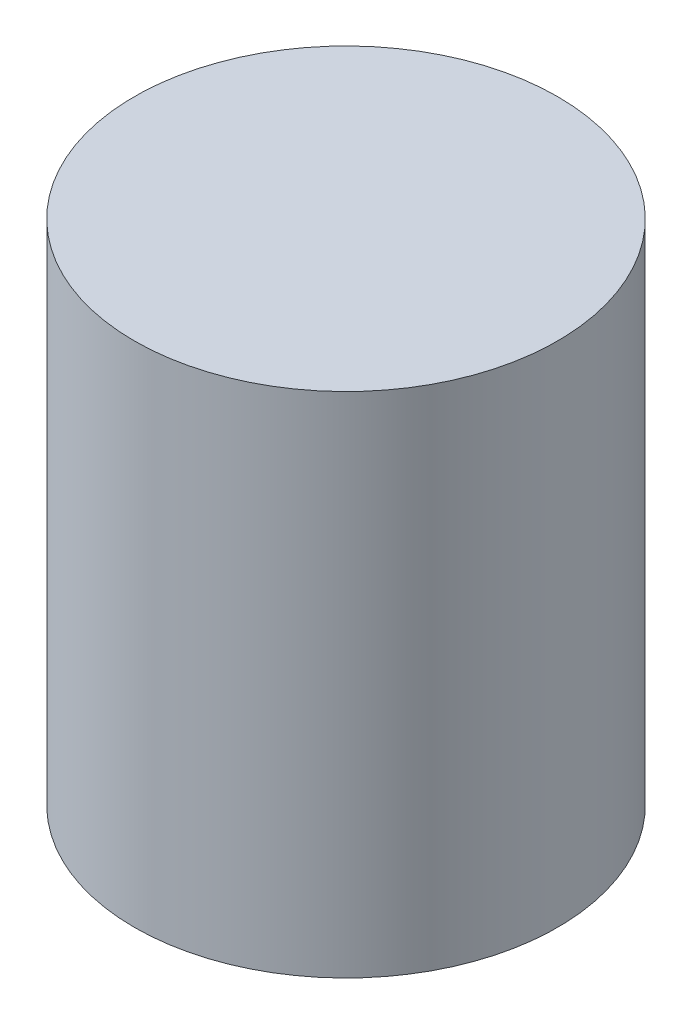
ISO-10303-21;
HEADER;
FILE_DESCRIPTION(('STEP AP214'),'2;1');
FILE_NAME('part.step','',(''),(''),'','','');
FILE_SCHEMA(('AUTOMOTIVE_DESIGN { 1 0 10303 214 1 1 1 1 }'));
ENDSEC;
DATA;
#1=APPLICATION_CONTEXT('core data for automotive mechanical design processes');
#2=APPLICATION_PROTOCOL_DEFINITION('international standard','automotive_design',2000,#1);
#3=PRODUCT_CONTEXT('',#1,'mechanical');
#4=PRODUCT('Part','Part','',(#3));
#5=PRODUCT_RELATED_PRODUCT_CATEGORY('part','',(#4));
#6=PRODUCT_DEFINITION_FORMATION('','',#4);
#7=PRODUCT_DEFINITION_CONTEXT('part definition',#1,'design');
#8=PRODUCT_DEFINITION('design','',#6,#7);
#9=PRODUCT_DEFINITION_SHAPE('','',#8);
#10=(LENGTH_UNIT() NAMED_UNIT(*) SI_UNIT(.MILLI.,.METRE.));
#11=(NAMED_UNIT(*) PLANE_ANGLE_UNIT() SI_UNIT($,.RADIAN.));
#12=(NAMED_UNIT(*) SI_UNIT($,.STERADIAN.) SOLID_ANGLE_UNIT());
#13=UNCERTAINTY_MEASURE_WITH_UNIT(LENGTH_MEASURE(1.E-05),#10,'distance_accuracy_value','');
#14=(GEOMETRIC_REPRESENTATION_CONTEXT(3) GLOBAL_UNCERTAINTY_ASSIGNED_CONTEXT((#13)) GLOBAL_UNIT_ASSIGNED_CONTEXT((#10,
#11,#12)) REPRESENTATION_CONTEXT('',''));
#15=CARTESIAN_POINT('',(0.,0.,0.));
#16=DIRECTION('',(0.,0.,1.));
#17=DIRECTION('',(1.,0.,0.));
#18=AXIS2_PLACEMENT_3D('',#15,#16,#17);
#19=CARTESIAN_POINT('',(0.,1.524,0.));
#20=DIRECTION('',(0.,-1.,0.));
#21=DIRECTION('',(0.,0.,-1.));
#22=AXIS2_PLACEMENT_3D('',#19,#20,#21);
#23=CYLINDRICAL_SURFACE('',#22,0.635);
#24=CARTESIAN_POINT('',(0.,1.524,0.));
#25=DIRECTION('',(0.,1.,0.));
#26=DIRECTION('',(0.,0.,1.));
#27=AXIS2_PLACEMENT_3D('',#24,#25,#26);
#28=CIRCLE('',#27,0.635);
#29=CARTESIAN_POINT('',(0.,1.524,0.635));
#30=VERTEX_POINT('',#29);
#31=EDGE_CURVE('E10',#30,#30,#28,.T.);
#32=ORIENTED_EDGE('',*,*,#31,.F.);
#33=EDGE_LOOP('',(#32));
#34=FACE_BOUND('',#33,.T.);
#35=CARTESIAN_POINT('',(0.,0.,0.));
#36=DIRECTION('',(0.,1.,0.));
#37=DIRECTION('',(0.,0.,1.));
#38=AXIS2_PLACEMENT_3D('',#35,#36,#37);
#39=CIRCLE('',#38,0.635);
#40=CARTESIAN_POINT('',(0.,0.,0.635));
#41=VERTEX_POINT('',#40);
#42=EDGE_CURVE('E34',#41,#41,#39,.T.);
#43=ORIENTED_EDGE('',*,*,#42,.T.);
#44=EDGE_LOOP('',(#43));
#45=FACE_BOUND('',#44,.T.);
#46=ADVANCED_FACE('F31',(#34,#45),#23,.T.);
#47=CARTESIAN_POINT('',(0.,1.524,0.));
#48=DIRECTION('',(0.,1.,0.));
#49=DIRECTION('',(0.,0.,1.));
#50=AXIS2_PLACEMENT_3D('',#47,#48,#49);
#51=PLANE('',#50);
#52=ORIENTED_EDGE('',*,*,#31,.T.);
#53=EDGE_LOOP('',(#52));
#54=FACE_BOUND('',#53,.T.);
#55=ADVANCED_FACE('F46',(#54),#51,.T.);
#56=CARTESIAN_POINT('',(0.,0.,0.));
#57=DIRECTION('',(0.,1.,0.));
#58=DIRECTION('',(0.,0.,1.));
#59=AXIS2_PLACEMENT_3D('',#56,#57,#58);
#60=PLANE('',#59);
#61=ORIENTED_EDGE('',*,*,#42,.F.);
#62=EDGE_LOOP('',(#61));
#63=FACE_BOUND('',#62,.T.);
#64=ADVANCED_FACE('F44',(#63),#60,.F.);
#65=CLOSED_SHELL('',(#46,#55,#64));
#66=MANIFOLD_SOLID_BREP('B2',#65);
#67=ADVANCED_BREP_SHAPE_REPRESENTATION('',(#18,#66),#14);
#68=SHAPE_DEFINITION_REPRESENTATION(#9,#67);
ENDSEC;
END-ISO-10303-21;
